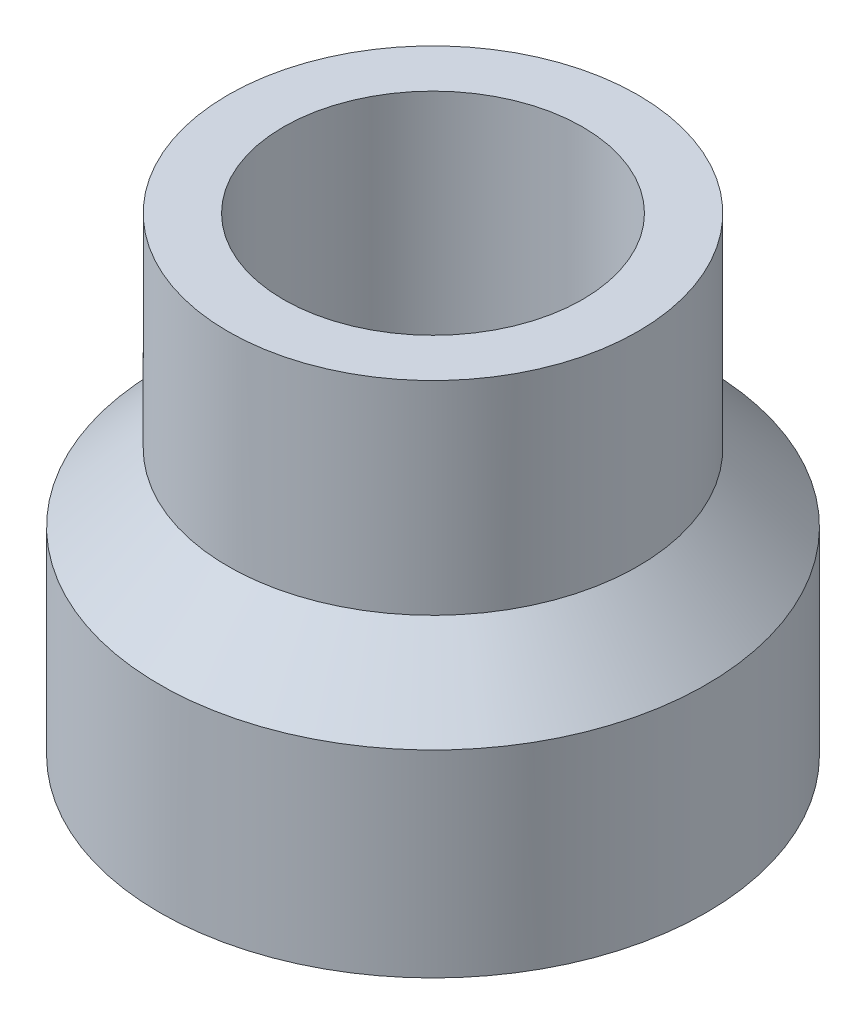
ISO-10303-21;
HEADER;
FILE_DESCRIPTION(('STEP AP214'),'2;1');
FILE_NAME('part.step','',(''),(''),'','','');
FILE_SCHEMA(('AUTOMOTIVE_DESIGN { 1 0 10303 214 1 1 1 1 }'));
ENDSEC;
DATA;
#1=APPLICATION_CONTEXT('core data for automotive mechanical design processes');
#2=APPLICATION_PROTOCOL_DEFINITION('international standard','automotive_design',2000,#1);
#3=PRODUCT_CONTEXT('',#1,'mechanical');
#4=PRODUCT('Part','Part','',(#3));
#5=PRODUCT_RELATED_PRODUCT_CATEGORY('part','',(#4));
#6=PRODUCT_DEFINITION_FORMATION('','',#4);
#7=PRODUCT_DEFINITION_CONTEXT('part definition',#1,'design');
#8=PRODUCT_DEFINITION('design','',#6,#7);
#9=PRODUCT_DEFINITION_SHAPE('','',#8);
#10=(LENGTH_UNIT() NAMED_UNIT(*) SI_UNIT(.MILLI.,.METRE.));
#11=(NAMED_UNIT(*) PLANE_ANGLE_UNIT() SI_UNIT($,.RADIAN.));
#12=(NAMED_UNIT(*) SI_UNIT($,.STERADIAN.) SOLID_ANGLE_UNIT());
#13=UNCERTAINTY_MEASURE_WITH_UNIT(LENGTH_MEASURE(1.E-05),#10,'distance_accuracy_value','');
#14=(GEOMETRIC_REPRESENTATION_CONTEXT(3) GLOBAL_UNCERTAINTY_ASSIGNED_CONTEXT((#13)) GLOBAL_UNIT_ASSIGNED_CONTEXT((#10,
#11,#12)) REPRESENTATION_CONTEXT('',''));
#15=CARTESIAN_POINT('',(0.,0.,0.));
#16=DIRECTION('',(0.,0.,1.));
#17=DIRECTION('',(1.,0.,0.));
#18=AXIS2_PLACEMENT_3D('',#15,#16,#17);
#19=CARTESIAN_POINT('',(0.,3.175,0.));
#20=DIRECTION('',(0.,-1.,0.));
#21=DIRECTION('',(0.,0.,-1.));
#22=AXIS2_PLACEMENT_3D('',#19,#20,#21);
#23=CYLINDRICAL_SURFACE('',#22,6.35);
#24=CARTESIAN_POINT('',(0.,4.58750000000004,0.));
#25=DIRECTION('',(0.,-1.,0.));
#26=DIRECTION('',(0.,0.,-1.));
#27=AXIS2_PLACEMENT_3D('',#24,#25,#26);
#28=CIRCLE('',#27,6.35);
#29=CARTESIAN_POINT('',(0.,4.58750000000004,-6.35));
#30=VERTEX_POINT('',#29);
#31=EDGE_CURVE('E10',#30,#30,#28,.T.);
#32=ORIENTED_EDGE('',*,*,#31,.T.);
#33=EDGE_LOOP('',(#32));
#34=FACE_BOUND('',#33,.T.);
#35=CARTESIAN_POINT('',(0.,0.,0.));
#36=DIRECTION('',(0.,1.,0.));
#37=DIRECTION('',(0.,0.,1.));
#38=AXIS2_PLACEMENT_3D('',#35,#36,#37);
#39=CIRCLE('',#38,6.35);
#40=CARTESIAN_POINT('',(0.,0.,6.35));
#41=VERTEX_POINT('',#40);
#42=EDGE_CURVE('E42',#41,#41,#39,.T.);
#43=ORIENTED_EDGE('',*,*,#42,.T.);
#44=EDGE_LOOP('',(#43));
#45=FACE_BOUND('',#44,.T.);
#46=ADVANCED_FACE('F31',(#34,#45),#23,.T.);
#47=CARTESIAN_POINT('',(0.,0.,0.));
#48=DIRECTION('',(0.,1.,0.));
#49=DIRECTION('',(0.,0.,1.));
#50=AXIS2_PLACEMENT_3D('',#47,#48,#49);
#51=PLANE('',#50);
#52=ORIENTED_EDGE('',*,*,#42,.F.);
#53=EDGE_LOOP('',(#52));
#54=FACE_BOUND('',#53,.T.);
#55=CARTESIAN_POINT('',(0.,0.,0.));
#56=DIRECTION('',(0.,1.,0.));
#57=DIRECTION('',(0.,0.,1.));
#58=AXIS2_PLACEMENT_3D('',#55,#56,#57);
#59=CIRCLE('',#58,3.475);
#60=CARTESIAN_POINT('',(0.,0.,3.475));
#61=VERTEX_POINT('',#60);
#62=EDGE_CURVE('E49',#61,#61,#59,.T.);
#63=ORIENTED_EDGE('',*,*,#62,.T.);
#64=EDGE_LOOP('',(#63));
#65=FACE_BOUND('',#64,.T.);
#66=ADVANCED_FACE('F73',(#54,#65),#51,.F.);
#67=CARTESIAN_POINT('',(0.,10.9,0.));
#68=DIRECTION('',(0.,-1.,0.));
#69=DIRECTION('',(0.,0.,-1.));
#70=AXIS2_PLACEMENT_3D('',#67,#68,#69);
#71=CYLINDRICAL_SURFACE('',#70,3.475);
#72=CARTESIAN_POINT('',(0.,10.9,0.));
#73=DIRECTION('',(0.,1.,0.));
#74=DIRECTION('',(0.,0.,1.));
#75=AXIS2_PLACEMENT_3D('',#72,#73,#74);
#76=CIRCLE('',#75,3.475);
#77=CARTESIAN_POINT('',(0.,10.9,3.475));
#78=VERTEX_POINT('',#77);
#79=EDGE_CURVE('E52',#78,#78,#76,.T.);
#80=ORIENTED_EDGE('',*,*,#79,.T.);
#81=EDGE_LOOP('',(#80));
#82=FACE_BOUND('',#81,.T.);
#83=ORIENTED_EDGE('',*,*,#62,.F.);
#84=EDGE_LOOP('',(#83));
#85=FACE_BOUND('',#84,.T.);
#86=ADVANCED_FACE('F58',(#82,#85),#71,.F.);
#87=CARTESIAN_POINT('',(0.,10.9,0.));
#88=DIRECTION('',(0.,-1.,0.));
#89=DIRECTION('',(0.,0.,-1.));
#90=AXIS2_PLACEMENT_3D('',#87,#88,#89);
#91=CYLINDRICAL_SURFACE('',#90,4.7625);
#92=CARTESIAN_POINT('',(0.,6.17500000000005,0.));
#93=DIRECTION('',(0.,1.,0.));
#94=DIRECTION('',(0.,0.,1.));
#95=AXIS2_PLACEMENT_3D('',#92,#93,#94);
#96=CIRCLE('',#95,4.7625);
#97=CARTESIAN_POINT('',(0.,6.17500000000005,-4.7625));
#98=VERTEX_POINT('',#97);
#99=EDGE_CURVE('E38',#98,#98,#96,.T.);
#100=ORIENTED_EDGE('',*,*,#99,.T.);
#101=EDGE_LOOP('',(#100));
#102=FACE_BOUND('',#101,.T.);
#103=CARTESIAN_POINT('',(0.,10.9,0.));
#104=DIRECTION('',(0.,1.,0.));
#105=DIRECTION('',(0.,0.,1.));
#106=AXIS2_PLACEMENT_3D('',#103,#104,#105);
#107=CIRCLE('',#106,4.7625);
#108=CARTESIAN_POINT('',(0.,10.9,4.7625));
#109=VERTEX_POINT('',#108);
#110=EDGE_CURVE('E46',#109,#109,#107,.T.);
#111=ORIENTED_EDGE('',*,*,#110,.F.);
#112=EDGE_LOOP('',(#111));
#113=FACE_BOUND('',#112,.T.);
#114=ADVANCED_FACE('F64',(#102,#113),#91,.T.);
#115=CARTESIAN_POINT('',(0.,10.9,0.));
#116=DIRECTION('',(0.,1.,0.));
#117=DIRECTION('',(0.,0.,1.));
#118=AXIS2_PLACEMENT_3D('',#115,#116,#117);
#119=PLANE('',#118);
#120=ORIENTED_EDGE('',*,*,#79,.F.);
#121=EDGE_LOOP('',(#120));
#122=FACE_BOUND('',#121,.T.);
#123=ORIENTED_EDGE('',*,*,#110,.T.);
#124=EDGE_LOOP('',(#123));
#125=FACE_BOUND('',#124,.T.);
#126=ADVANCED_FACE('F61',(#122,#125),#119,.T.);
#127=CARTESIAN_POINT('',(0.,6.17500000000005,0.));
#128=DIRECTION('',(0.,-1.,0.));
#129=DIRECTION('',(0.,0.,-1.));
#130=AXIS2_PLACEMENT_3D('',#127,#128,#129);
#131=CONICAL_SURFACE('',#130,4.7625,0.785398163397443);
#132=CARTESIAN_POINT('',(0.,4.58750000000004,-6.35));
#133=CARTESIAN_POINT('',(0.,4.60403645833337,-6.33346354166667));
#134=CARTESIAN_POINT('',(0.,4.6205729166667,-6.31692708333333));
#135=CARTESIAN_POINT('',(0.,4.65364583333337,-6.28385416666667));
#136=CARTESIAN_POINT('',(0.,4.6701822916667,-6.26731770833333));
#137=CARTESIAN_POINT('',(0.,4.70325520833337,-6.23424479166667));
#138=CARTESIAN_POINT('',(0.,4.7197916666667,-6.21770833333333));
#139=CARTESIAN_POINT('',(0.,4.75286458333337,-6.18463541666667));
#140=CARTESIAN_POINT('',(0.,4.7694010416667,-6.16809895833333));
#141=CARTESIAN_POINT('',(0.,4.80247395833337,-6.13502604166667));
#142=CARTESIAN_POINT('',(0.,4.81901041666671,-6.11848958333333));
#143=CARTESIAN_POINT('',(0.,4.85208333333337,-6.08541666666667));
#144=CARTESIAN_POINT('',(0.,4.86861979166671,-6.06888020833333));
#145=CARTESIAN_POINT('',(0.,4.90169270833337,-6.03580729166667));
#146=CARTESIAN_POINT('',(0.,4.91822916666671,-6.01927083333333));
#147=CARTESIAN_POINT('',(0.,4.95130208333337,-5.98619791666667));
#148=CARTESIAN_POINT('',(0.,4.96783854166671,-5.96966145833333));
#149=CARTESIAN_POINT('',(0.,5.00091145833337,-5.93658854166667));
#150=CARTESIAN_POINT('',(0.,5.01744791666671,-5.92005208333333));
#151=CARTESIAN_POINT('',(0.,5.05052083333337,-5.88697916666667));
#152=CARTESIAN_POINT('',(0.,5.06705729166671,-5.87044270833333));
#153=CARTESIAN_POINT('',(0.,5.10013020833337,-5.83736979166667));
#154=CARTESIAN_POINT('',(0.,5.11666666666671,-5.82083333333333));
#155=CARTESIAN_POINT('',(0.,5.14973958333337,-5.78776041666667));
#156=CARTESIAN_POINT('',(0.,5.16627604166671,-5.77122395833333));
#157=CARTESIAN_POINT('',(0.,5.19934895833338,-5.73815104166667));
#158=CARTESIAN_POINT('',(0.,5.21588541666671,-5.72161458333333));
#159=CARTESIAN_POINT('',(0.,5.24895833333338,-5.68854166666667));
#160=CARTESIAN_POINT('',(0.,5.26549479166671,-5.67200520833333));
#161=CARTESIAN_POINT('',(0.,5.29856770833338,-5.63893229166667));
#162=CARTESIAN_POINT('',(0.,5.31510416666671,-5.62239583333333));
#163=CARTESIAN_POINT('',(0.,5.34817708333338,-5.58932291666667));
#164=CARTESIAN_POINT('',(0.,5.36471354166671,-5.57278645833333));
#165=CARTESIAN_POINT('',(0.,5.39778645833338,-5.53971354166667));
#166=CARTESIAN_POINT('',(0.,5.41432291666671,-5.52317708333333));
#167=CARTESIAN_POINT('',(0.,5.44739583333338,-5.49010416666667));
#168=CARTESIAN_POINT('',(0.,5.46393229166671,-5.47356770833333));
#169=CARTESIAN_POINT('',(0.,5.49700520833338,-5.44049479166667));
#170=CARTESIAN_POINT('',(0.,5.51354166666671,-5.42395833333333));
#171=CARTESIAN_POINT('',(0.,5.54661458333338,-5.39088541666667));
#172=CARTESIAN_POINT('',(0.,5.56315104166671,-5.37434895833333));
#173=CARTESIAN_POINT('',(0.,5.59622395833338,-5.34127604166667));
#174=CARTESIAN_POINT('',(0.,5.61276041666671,-5.32473958333333));
#175=CARTESIAN_POINT('',(0.,5.64583333333338,-5.29166666666667));
#176=CARTESIAN_POINT('',(0.,5.66236979166671,-5.27513020833333));
#177=CARTESIAN_POINT('',(0.,5.69544270833338,-5.24205729166667));
#178=CARTESIAN_POINT('',(0.,5.71197916666671,-5.22552083333333));
#179=CARTESIAN_POINT('',(0.,5.74505208333338,-5.19244791666667));
#180=CARTESIAN_POINT('',(0.,5.76158854166671,-5.17591145833333));
#181=CARTESIAN_POINT('',(0.,5.79466145833338,-5.14283854166667));
#182=CARTESIAN_POINT('',(0.,5.81119791666671,-5.12630208333333));
#183=CARTESIAN_POINT('',(0.,5.84427083333338,-5.09322916666667));
#184=CARTESIAN_POINT('',(0.,5.86080729166672,-5.07669270833333));
#185=CARTESIAN_POINT('',(0.,5.89388020833338,-5.04361979166667));
#186=CARTESIAN_POINT('',(0.,5.91041666666672,-5.02708333333333));
#187=CARTESIAN_POINT('',(0.,5.94348958333338,-4.99401041666667));
#188=CARTESIAN_POINT('',(0.,5.96002604166672,-4.97747395833333));
#189=CARTESIAN_POINT('',(0.,5.99309895833338,-4.94440104166667));
#190=CARTESIAN_POINT('',(0.,6.00963541666672,-4.92786458333333));
#191=CARTESIAN_POINT('',(0.,6.04270833333338,-4.89479166666667));
#192=CARTESIAN_POINT('',(0.,6.05924479166672,-4.87825520833333));
#193=CARTESIAN_POINT('',(0.,6.09231770833338,-4.84518229166667));
#194=CARTESIAN_POINT('',(0.,6.10885416666672,-4.82864583333333));
#195=CARTESIAN_POINT('',(0.,6.14192708333338,-4.79557291666667));
#196=CARTESIAN_POINT('',(0.,6.15846354166672,-4.77903645833333));
#197=CARTESIAN_POINT('',(0.,6.17500000000005,-4.7625));
#198=B_SPLINE_CURVE_WITH_KNOTS('',3,(#132,#133,#134,#135,#136,#137,#138,#139,#140,#141,#142,
#143,#144,#145,#146,#147,#148,#149,#150,#151,#152,#153,#154,#155,#156,#157,#158,#159,#160,#161,
#162,#163,#164,#165,#166,#167,#168,#169,#170,#171,#172,#173,#174,#175,#176,#177,#178,#179,#180,
#181,#182,#183,#184,#185,#186,#187,#188,#189,#190,#191,#192,#193,#194,#195,#196,#197),
.UNSPECIFIED.,.F.,.F.,(4,2,2,2,2,2,2,2,2,2,2,2,2,2,2,2,2,2,2,2,2,2,2,2,2,2,2,2,2,2,2,2,4),(0.,
0.070158250945853,0.140316501891706,0.210474752837559,0.280633003783413,0.350791254729266,
0.420949505675119,0.491107756620972,0.561266007566825,0.631424258512678,0.701582509458531,
0.771740760404384,0.841899011350237,0.91205726229609,0.982215513241943,1.0523737641878,
1.12253201513365,1.1926902660795,1.26284851702536,1.33300676797121,1.40316501891706,
1.47332326986291,1.54348152080877,1.61363977175462,1.68379802270047,1.75395627364633,
1.82411452459218,1.89427277553803,1.96443102648388,2.03458927742974,2.10474752837559,
2.17490577932144,2.2450640302673),.UNSPECIFIED.);
#199=EDGE_CURVE('BSEAM33',#30,#98,#198,.T.);
#200=ORIENTED_EDGE('',*,*,#31,.F.);
#201=ORIENTED_EDGE('',*,*,#99,.F.);
#202=ORIENTED_EDGE('',*,*,#199,.T.);
#203=ORIENTED_EDGE('',*,*,#199,.F.);
#204=EDGE_LOOP('',(#200,#202,#201,#203));
#205=FACE_BOUND('',#204,.T.);
#206=ADVANCED_FACE('F33',(#205),#131,.T.);
#207=CLOSED_SHELL('',(#46,#66,#86,#114,#126,#206));
#208=MANIFOLD_SOLID_BREP('B2',#207);
#209=ADVANCED_BREP_SHAPE_REPRESENTATION('',(#18,#208),#14);
#210=SHAPE_DEFINITION_REPRESENTATION(#9,#209);
ENDSEC;
END-ISO-10303-21;
